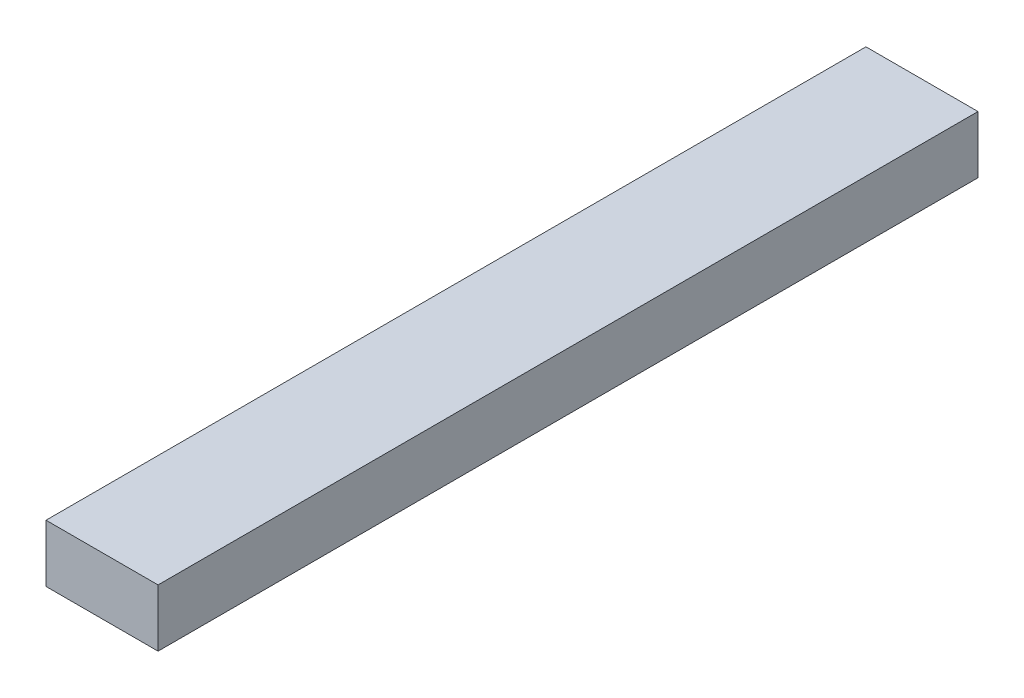
ISO-10303-21;
HEADER;
FILE_DESCRIPTION(('STEP AP214'),'2;1');
FILE_NAME('part.step','',(''),(''),'','','');
FILE_SCHEMA(('AUTOMOTIVE_DESIGN { 1 0 10303 214 1 1 1 1 }'));
ENDSEC;
DATA;
#1=APPLICATION_CONTEXT('core data for automotive mechanical design processes');
#2=APPLICATION_PROTOCOL_DEFINITION('international standard','automotive_design',2000,#1);
#3=PRODUCT_CONTEXT('',#1,'mechanical');
#4=PRODUCT('Part','Part','',(#3));
#5=PRODUCT_RELATED_PRODUCT_CATEGORY('part','',(#4));
#6=PRODUCT_DEFINITION_FORMATION('','',#4);
#7=PRODUCT_DEFINITION_CONTEXT('part definition',#1,'design');
#8=PRODUCT_DEFINITION('design','',#6,#7);
#9=PRODUCT_DEFINITION_SHAPE('','',#8);
#10=(LENGTH_UNIT() NAMED_UNIT(*) SI_UNIT(.MILLI.,.METRE.));
#11=(NAMED_UNIT(*) PLANE_ANGLE_UNIT() SI_UNIT($,.RADIAN.));
#12=(NAMED_UNIT(*) SI_UNIT($,.STERADIAN.) SOLID_ANGLE_UNIT());
#13=UNCERTAINTY_MEASURE_WITH_UNIT(LENGTH_MEASURE(1.E-05),#10,'distance_accuracy_value','');
#14=(GEOMETRIC_REPRESENTATION_CONTEXT(3) GLOBAL_UNCERTAINTY_ASSIGNED_CONTEXT((#13)) GLOBAL_UNIT_ASSIGNED_CONTEXT((#10,
#11,#12)) REPRESENTATION_CONTEXT('',''));
#15=CARTESIAN_POINT('',(0.,0.,0.));
#16=DIRECTION('',(0.,0.,1.));
#17=DIRECTION('',(1.,0.,0.));
#18=AXIS2_PLACEMENT_3D('',#15,#16,#17);
#19=CARTESIAN_POINT('',(20.5,10.5,300.));
#20=DIRECTION('',(-1.,0.,0.));
#21=DIRECTION('',(0.,0.,1.));
#22=AXIS2_PLACEMENT_3D('',#19,#20,#21);
#23=PLANE('',#22);
#24=DIRECTION('',(0.,1.,0.));
#25=VECTOR('',#24,1.);
#26=CARTESIAN_POINT('',(20.5,10.5,0.));
#27=LINE('',#26,#25);
#28=CARTESIAN_POINT('',(20.5,-10.5,0.));
#29=VERTEX_POINT('',#28);
#30=CARTESIAN_POINT('',(20.5,10.5,0.));
#31=VERTEX_POINT('',#30);
#32=EDGE_CURVE('E94',#29,#31,#27,.T.);
#33=ORIENTED_EDGE('',*,*,#32,.T.);
#34=DIRECTION('',(0.,0.,-1.));
#35=VECTOR('',#34,1.);
#36=CARTESIAN_POINT('',(20.5,10.5,300.));
#37=LINE('',#36,#35);
#38=CARTESIAN_POINT('',(20.5,10.5,300.));
#39=VERTEX_POINT('',#38);
#40=EDGE_CURVE('E11',#39,#31,#37,.T.);
#41=ORIENTED_EDGE('',*,*,#40,.F.);
#42=DIRECTION('',(0.,1.,0.));
#43=VECTOR('',#42,1.);
#44=CARTESIAN_POINT('',(20.5,10.5,300.));
#45=LINE('',#44,#43);
#46=CARTESIAN_POINT('',(20.5,-10.5,300.));
#47=VERTEX_POINT('',#46);
#48=EDGE_CURVE('E82',#47,#39,#45,.T.);
#49=ORIENTED_EDGE('',*,*,#48,.F.);
#50=DIRECTION('',(0.,0.,-1.));
#51=VECTOR('',#50,1.);
#52=CARTESIAN_POINT('',(20.5,-10.5,300.));
#53=LINE('',#52,#51);
#54=EDGE_CURVE('E90',#47,#29,#53,.T.);
#55=ORIENTED_EDGE('',*,*,#54,.T.);
#56=EDGE_LOOP('',(#33,#41,#49,#55));
#57=FACE_BOUND('',#56,.T.);
#58=ADVANCED_FACE('F31',(#57),#23,.F.);
#59=CARTESIAN_POINT('',(-20.5,10.5,300.));
#60=DIRECTION('',(0.,-1.,0.));
#61=DIRECTION('',(0.,0.,-1.));
#62=AXIS2_PLACEMENT_3D('',#59,#60,#61);
#63=PLANE('',#62);
#64=DIRECTION('',(-1.,0.,0.));
#65=VECTOR('',#64,1.);
#66=CARTESIAN_POINT('',(-20.5,10.5,0.));
#67=LINE('',#66,#65);
#68=CARTESIAN_POINT('',(-20.5,10.5,0.));
#69=VERTEX_POINT('',#68);
#70=EDGE_CURVE('E86',#31,#69,#67,.T.);
#71=ORIENTED_EDGE('',*,*,#70,.T.);
#72=DIRECTION('',(0.,0.,-1.));
#73=VECTOR('',#72,1.);
#74=CARTESIAN_POINT('',(-20.5,10.5,300.));
#75=LINE('',#74,#73);
#76=CARTESIAN_POINT('',(-20.5,10.5,300.));
#77=VERTEX_POINT('',#76);
#78=EDGE_CURVE('E39',#77,#69,#75,.T.);
#79=ORIENTED_EDGE('',*,*,#78,.F.);
#80=DIRECTION('',(-1.,0.,0.));
#81=VECTOR('',#80,1.);
#82=CARTESIAN_POINT('',(-20.5,10.5,300.));
#83=LINE('',#82,#81);
#84=EDGE_CURVE('E77',#39,#77,#83,.T.);
#85=ORIENTED_EDGE('',*,*,#84,.F.);
#86=ORIENTED_EDGE('',*,*,#40,.T.);
#87=EDGE_LOOP('',(#71,#79,#85,#86));
#88=FACE_BOUND('',#87,.T.);
#89=ADVANCED_FACE('F85',(#88),#63,.F.);
#90=CARTESIAN_POINT('',(-20.5,10.5,300.));
#91=DIRECTION('',(1.,0.,0.));
#92=DIRECTION('',(0.,0.,-1.));
#93=AXIS2_PLACEMENT_3D('',#90,#91,#92);
#94=PLANE('',#93);
#95=DIRECTION('',(0.,-1.,0.));
#96=VECTOR('',#95,1.);
#97=CARTESIAN_POINT('',(-20.5,10.5,0.));
#98=LINE('',#97,#96);
#99=CARTESIAN_POINT('',(-20.5,-10.5,0.));
#100=VERTEX_POINT('',#99);
#101=EDGE_CURVE('E64',#69,#100,#98,.T.);
#102=ORIENTED_EDGE('',*,*,#101,.T.);
#103=DIRECTION('',(0.,0.,-1.));
#104=VECTOR('',#103,1.);
#105=CARTESIAN_POINT('',(-20.5,-10.5,300.));
#106=LINE('',#105,#104);
#107=CARTESIAN_POINT('',(-20.5,-10.5,300.));
#108=VERTEX_POINT('',#107);
#109=EDGE_CURVE('E87',#108,#100,#106,.T.);
#110=ORIENTED_EDGE('',*,*,#109,.F.);
#111=DIRECTION('',(0.,-1.,0.));
#112=VECTOR('',#111,1.);
#113=CARTESIAN_POINT('',(-20.5,10.5,300.));
#114=LINE('',#113,#112);
#115=EDGE_CURVE('E80',#77,#108,#114,.T.);
#116=ORIENTED_EDGE('',*,*,#115,.F.);
#117=ORIENTED_EDGE('',*,*,#78,.T.);
#118=EDGE_LOOP('',(#102,#110,#116,#117));
#119=FACE_BOUND('',#118,.T.);
#120=ADVANCED_FACE('F88',(#119),#94,.F.);
#121=CARTESIAN_POINT('',(-20.5,-10.5,300.));
#122=DIRECTION('',(0.,1.,0.));
#123=DIRECTION('',(0.,0.,1.));
#124=AXIS2_PLACEMENT_3D('',#121,#122,#123);
#125=PLANE('',#124);
#126=DIRECTION('',(1.,0.,0.));
#127=VECTOR('',#126,1.);
#128=CARTESIAN_POINT('',(-20.5,-10.5,0.));
#129=LINE('',#128,#127);
#130=EDGE_CURVE('E70',#100,#29,#129,.T.);
#131=ORIENTED_EDGE('',*,*,#130,.T.);
#132=ORIENTED_EDGE('',*,*,#54,.F.);
#133=DIRECTION('',(1.,0.,0.));
#134=VECTOR('',#133,1.);
#135=CARTESIAN_POINT('',(-20.5,-10.5,300.));
#136=LINE('',#135,#134);
#137=EDGE_CURVE('E47',#108,#47,#136,.T.);
#138=ORIENTED_EDGE('',*,*,#137,.F.);
#139=ORIENTED_EDGE('',*,*,#109,.T.);
#140=EDGE_LOOP('',(#131,#132,#138,#139));
#141=FACE_BOUND('',#140,.T.);
#142=ADVANCED_FACE('F101',(#141),#125,.F.);
#143=CARTESIAN_POINT('',(20.5,-10.5,300.));
#144=DIRECTION('',(0.,0.,1.));
#145=DIRECTION('',(1.,0.,0.));
#146=AXIS2_PLACEMENT_3D('',#143,#144,#145);
#147=PLANE('',#146);
#148=ORIENTED_EDGE('',*,*,#48,.T.);
#149=ORIENTED_EDGE('',*,*,#84,.T.);
#150=ORIENTED_EDGE('',*,*,#115,.T.);
#151=ORIENTED_EDGE('',*,*,#137,.T.);
#152=EDGE_LOOP('',(#148,#149,#150,#151));
#153=FACE_BOUND('',#152,.T.);
#154=ADVANCED_FACE('F78',(#153),#147,.T.);
#155=CARTESIAN_POINT('',(20.5,-10.5,0.));
#156=DIRECTION('',(0.,0.,1.));
#157=DIRECTION('',(1.,0.,0.));
#158=AXIS2_PLACEMENT_3D('',#155,#156,#157);
#159=PLANE('',#158);
#160=ORIENTED_EDGE('',*,*,#32,.F.);
#161=ORIENTED_EDGE('',*,*,#130,.F.);
#162=ORIENTED_EDGE('',*,*,#101,.F.);
#163=ORIENTED_EDGE('',*,*,#70,.F.);
#164=EDGE_LOOP('',(#160,#161,#162,#163));
#165=FACE_BOUND('',#164,.T.);
#166=ADVANCED_FACE('F104',(#165),#159,.F.);
#167=CLOSED_SHELL('',(#58,#89,#120,#142,#154,#166));
#168=MANIFOLD_SOLID_BREP('B2',#167);
#169=ADVANCED_BREP_SHAPE_REPRESENTATION('',(#18,#168),#14);
#170=SHAPE_DEFINITION_REPRESENTATION(#9,#169);
ENDSEC;
END-ISO-10303-21;
